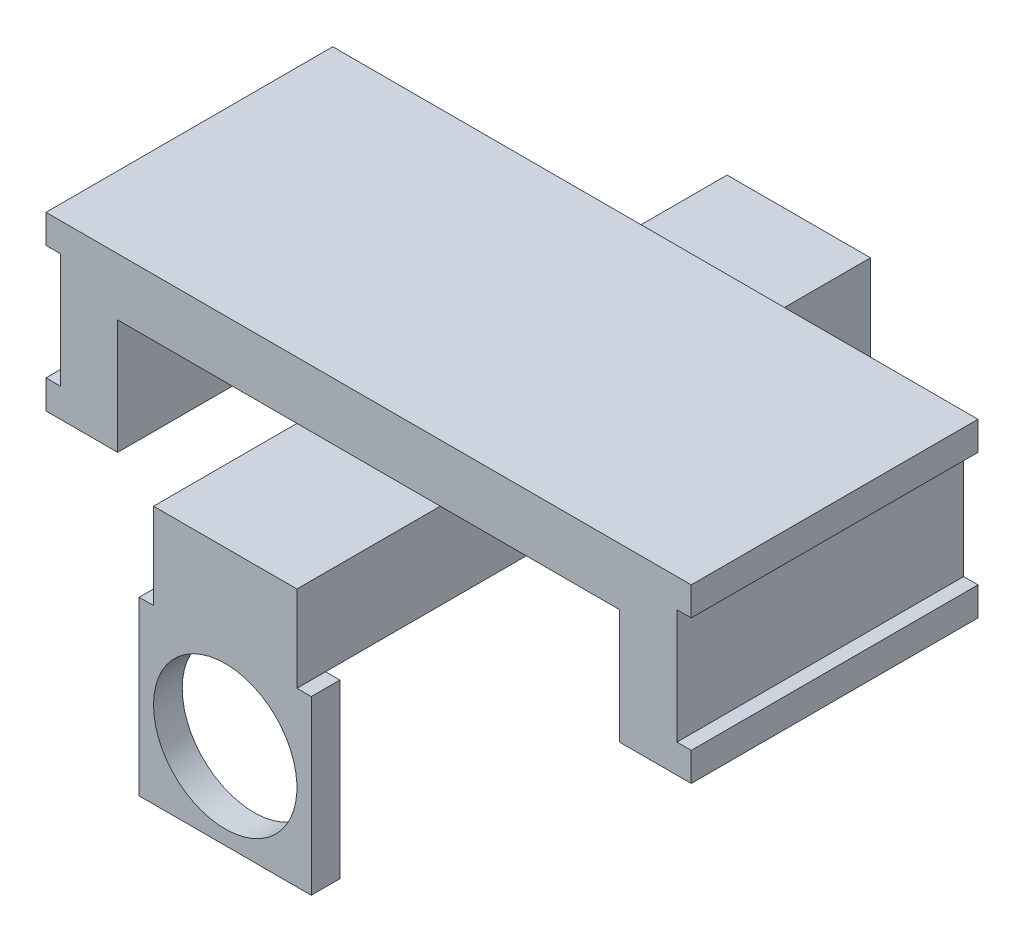
ISO-10303-21;
HEADER;
FILE_DESCRIPTION(('STEP AP214'),'2;1');
FILE_NAME('part.step','',(''),(''),'','','');
FILE_SCHEMA(('AUTOMOTIVE_DESIGN { 1 0 10303 214 1 1 1 1 }'));
ENDSEC;
DATA;
#1=APPLICATION_CONTEXT('core data for automotive mechanical design processes');
#2=APPLICATION_PROTOCOL_DEFINITION('international standard','automotive_design',2000,#1);
#3=PRODUCT_CONTEXT('',#1,'mechanical');
#4=PRODUCT('Part','Part','',(#3));
#5=PRODUCT_RELATED_PRODUCT_CATEGORY('part','',(#4));
#6=PRODUCT_DEFINITION_FORMATION('','',#4);
#7=PRODUCT_DEFINITION_CONTEXT('part definition',#1,'design');
#8=PRODUCT_DEFINITION('design','',#6,#7);
#9=PRODUCT_DEFINITION_SHAPE('','',#8);
#10=(LENGTH_UNIT() NAMED_UNIT(*) SI_UNIT(.MILLI.,.METRE.));
#11=(NAMED_UNIT(*) PLANE_ANGLE_UNIT() SI_UNIT($,.RADIAN.));
#12=(NAMED_UNIT(*) SI_UNIT($,.STERADIAN.) SOLID_ANGLE_UNIT());
#13=UNCERTAINTY_MEASURE_WITH_UNIT(LENGTH_MEASURE(1.E-05),#10,'distance_accuracy_value','');
#14=(GEOMETRIC_REPRESENTATION_CONTEXT(3) GLOBAL_UNCERTAINTY_ASSIGNED_CONTEXT((#13)) GLOBAL_UNIT_ASSIGNED_CONTEXT((#10,
#11,#12)) REPRESENTATION_CONTEXT('',''));
#15=CARTESIAN_POINT('',(0.,0.,0.));
#16=DIRECTION('',(0.,0.,1.));
#17=DIRECTION('',(1.,0.,0.));
#18=AXIS2_PLACEMENT_3D('',#15,#16,#17);
#19=CARTESIAN_POINT('',(0.,2.54,0.));
#20=DIRECTION('',(0.,-1.,0.));
#21=DIRECTION('',(0.,0.,-1.));
#22=AXIS2_PLACEMENT_3D('',#19,#20,#21);
#23=PLANE('',#22);
#24=DIRECTION('',(0.,0.,1.));
#25=VECTOR('',#24,1.);
#26=CARTESIAN_POINT('',(6.35,2.54,0.));
#27=LINE('',#26,#25);
#28=CARTESIAN_POINT('',(6.35,2.54,-22.86));
#29=VERTEX_POINT('',#28);
#30=CARTESIAN_POINT('',(6.35,2.54,22.86));
#31=VERTEX_POINT('',#30);
#32=EDGE_CURVE('E340',#29,#31,#27,.T.);
#33=ORIENTED_EDGE('',*,*,#32,.T.);
#34=DIRECTION('',(1.,0.,0.));
#35=VECTOR('',#34,1.);
#36=CARTESIAN_POINT('',(-7.62,2.54,22.86));
#37=LINE('',#36,#35);
#38=CARTESIAN_POINT('',(-6.35,2.54,22.86));
#39=VERTEX_POINT('',#38);
#40=EDGE_CURVE('E57',#39,#31,#37,.T.);
#41=ORIENTED_EDGE('',*,*,#40,.F.);
#42=DIRECTION('',(0.,0.,-1.));
#43=VECTOR('',#42,1.);
#44=CARTESIAN_POINT('',(-6.35,2.54,0.));
#45=LINE('',#44,#43);
#46=CARTESIAN_POINT('',(-6.35,2.54,-22.86));
#47=VERTEX_POINT('',#46);
#48=EDGE_CURVE('E341',#39,#47,#45,.T.);
#49=ORIENTED_EDGE('',*,*,#48,.T.);
#50=DIRECTION('',(1.,0.,0.));
#51=VECTOR('',#50,1.);
#52=CARTESIAN_POINT('',(-7.62,2.54,-22.86));
#53=LINE('',#52,#51);
#54=EDGE_CURVE('E11',#47,#29,#53,.T.);
#55=ORIENTED_EDGE('',*,*,#54,.T.);
#56=EDGE_LOOP('',(#33,#41,#49,#55));
#57=FACE_BOUND('',#56,.T.);
#58=ADVANCED_FACE('F39',(#57),#23,.T.);
#59=CARTESIAN_POINT('',(0.,10.16,0.));
#60=DIRECTION('',(0.,-1.,0.));
#61=DIRECTION('',(0.,0.,-1.));
#62=AXIS2_PLACEMENT_3D('',#59,#60,#61);
#63=PLANE('',#62);
#64=DIRECTION('',(1.,0.,0.));
#65=VECTOR('',#64,1.);
#66=CARTESIAN_POINT('',(-22.225,10.16,-12.7));
#67=LINE('',#66,#65);
#68=CARTESIAN_POINT('',(-22.225,10.16,-12.7));
#69=VERTEX_POINT('',#68);
#70=CARTESIAN_POINT('',(-6.35,10.16,-12.7));
#71=VERTEX_POINT('',#70);
#72=EDGE_CURVE('E426',#69,#71,#67,.T.);
#73=ORIENTED_EDGE('',*,*,#72,.T.);
#74=DIRECTION('',(0.,0.,1.));
#75=VECTOR('',#74,1.);
#76=CARTESIAN_POINT('',(-6.35,10.16,0.));
#77=LINE('',#76,#75);
#78=CARTESIAN_POINT('',(-6.35,10.16,12.7));
#79=VERTEX_POINT('',#78);
#80=EDGE_CURVE('E43',#71,#79,#77,.T.);
#81=ORIENTED_EDGE('',*,*,#80,.T.);
#82=DIRECTION('',(-1.,0.,0.));
#83=VECTOR('',#82,1.);
#84=CARTESIAN_POINT('',(-22.225,10.16,12.7));
#85=LINE('',#84,#83);
#86=CARTESIAN_POINT('',(-22.225,10.16,12.7));
#87=VERTEX_POINT('',#86);
#88=EDGE_CURVE('E433',#79,#87,#85,.T.);
#89=ORIENTED_EDGE('',*,*,#88,.T.);
#90=DIRECTION('',(0.,0.,-1.));
#91=VECTOR('',#90,1.);
#92=CARTESIAN_POINT('',(-22.225,10.16,12.7));
#93=LINE('',#92,#91);
#94=EDGE_CURVE('E421',#87,#69,#93,.T.);
#95=ORIENTED_EDGE('',*,*,#94,.T.);
#96=EDGE_LOOP('',(#73,#81,#89,#95));
#97=FACE_BOUND('',#96,.T.);
#98=ADVANCED_FACE('F497',(#97),#63,.T.);
#99=CARTESIAN_POINT('',(22.225,10.16,12.7));
#100=VERTEX_POINT('',#99);
#101=CARTESIAN_POINT('',(6.35,10.16,12.7));
#102=VERTEX_POINT('',#101);
#103=EDGE_CURVE('E434',#100,#102,#85,.T.);
#104=ORIENTED_EDGE('',*,*,#103,.T.);
#105=DIRECTION('',(0.,0.,-1.));
#106=VECTOR('',#105,1.);
#107=CARTESIAN_POINT('',(6.35,10.16,0.));
#108=LINE('',#107,#106);
#109=CARTESIAN_POINT('',(6.35,10.16,-12.7));
#110=VERTEX_POINT('',#109);
#111=EDGE_CURVE('E488',#102,#110,#108,.T.);
#112=ORIENTED_EDGE('',*,*,#111,.T.);
#113=CARTESIAN_POINT('',(22.225,10.16,-12.7));
#114=VERTEX_POINT('',#113);
#115=EDGE_CURVE('E424',#110,#114,#67,.T.);
#116=ORIENTED_EDGE('',*,*,#115,.T.);
#117=DIRECTION('',(0.,0.,1.));
#118=VECTOR('',#117,1.);
#119=CARTESIAN_POINT('',(22.225,10.16,12.7));
#120=LINE('',#119,#118);
#121=EDGE_CURVE('E429',#114,#100,#120,.T.);
#122=ORIENTED_EDGE('',*,*,#121,.T.);
#123=EDGE_LOOP('',(#104,#112,#116,#122));
#124=FACE_BOUND('',#123,.T.);
#125=ADVANCED_FACE('F547',(#124),#63,.T.);
#126=CARTESIAN_POINT('',(28.575,15.24,12.7));
#127=DIRECTION('',(-1.,0.,0.));
#128=DIRECTION('',(0.,0.,1.));
#129=AXIS2_PLACEMENT_3D('',#126,#127,#128);
#130=PLANE('',#129);
#131=DIRECTION('',(0.,-1.,0.));
#132=VECTOR('',#131,1.);
#133=CARTESIAN_POINT('',(28.575,15.24,-12.7));
#134=LINE('',#133,#132);
#135=CARTESIAN_POINT('',(28.575,2.54000000000001,-12.7));
#136=VERTEX_POINT('',#135);
#137=CARTESIAN_POINT('',(28.575,0.,-12.7));
#138=VERTEX_POINT('',#137);
#139=EDGE_CURVE('E485',#136,#138,#134,.T.);
#140=ORIENTED_EDGE('',*,*,#139,.F.);
#141=DIRECTION('',(0.,0.,1.));
#142=VECTOR('',#141,1.);
#143=CARTESIAN_POINT('',(28.575,2.54000000000001,-12.7));
#144=LINE('',#143,#142);
#145=CARTESIAN_POINT('',(28.575,2.54000000000001,12.7));
#146=VERTEX_POINT('',#145);
#147=EDGE_CURVE('E368',#136,#146,#144,.T.);
#148=ORIENTED_EDGE('',*,*,#147,.T.);
#149=DIRECTION('',(0.,-1.,0.));
#150=VECTOR('',#149,1.);
#151=CARTESIAN_POINT('',(28.575,15.24,12.7));
#152=LINE('',#151,#150);
#153=CARTESIAN_POINT('',(28.575,0.,12.7));
#154=VERTEX_POINT('',#153);
#155=EDGE_CURVE('E461',#146,#154,#152,.T.);
#156=ORIENTED_EDGE('',*,*,#155,.T.);
#157=DIRECTION('',(0.,0.,-1.));
#158=VECTOR('',#157,1.);
#159=CARTESIAN_POINT('',(28.575,0.,12.7));
#160=LINE('',#159,#158);
#161=EDGE_CURVE('E443',#154,#138,#160,.T.);
#162=ORIENTED_EDGE('',*,*,#161,.T.);
#163=EDGE_LOOP('',(#140,#148,#156,#162));
#164=FACE_BOUND('',#163,.T.);
#165=ADVANCED_FACE('F623',(#164),#130,.F.);
#166=CARTESIAN_POINT('',(-28.575,15.24,12.7));
#167=DIRECTION('',(1.,0.,0.));
#168=DIRECTION('',(0.,0.,-1.));
#169=AXIS2_PLACEMENT_3D('',#166,#167,#168);
#170=PLANE('',#169);
#171=DIRECTION('',(0.,-1.,0.));
#172=VECTOR('',#171,1.);
#173=CARTESIAN_POINT('',(-28.575,15.24,-12.7));
#174=LINE('',#173,#172);
#175=CARTESIAN_POINT('',(-28.575,15.24,-12.7));
#176=VERTEX_POINT('',#175);
#177=CARTESIAN_POINT('',(-28.575,12.7,-12.7));
#178=VERTEX_POINT('',#177);
#179=EDGE_CURVE('E482',#176,#178,#174,.T.);
#180=ORIENTED_EDGE('',*,*,#179,.T.);
#181=DIRECTION('',(0.,0.,1.));
#182=VECTOR('',#181,1.);
#183=CARTESIAN_POINT('',(-28.575,12.7,-12.7));
#184=LINE('',#183,#182);
#185=CARTESIAN_POINT('',(-28.575,12.7,12.7));
#186=VERTEX_POINT('',#185);
#187=EDGE_CURVE('E388',#178,#186,#184,.T.);
#188=ORIENTED_EDGE('',*,*,#187,.T.);
#189=DIRECTION('',(0.,-1.,0.));
#190=VECTOR('',#189,1.);
#191=CARTESIAN_POINT('',(-28.575,15.24,12.7));
#192=LINE('',#191,#190);
#193=CARTESIAN_POINT('',(-28.575,15.24,12.7));
#194=VERTEX_POINT('',#193);
#195=EDGE_CURVE('E478',#194,#186,#192,.T.);
#196=ORIENTED_EDGE('',*,*,#195,.F.);
#197=DIRECTION('',(0.,0.,1.));
#198=VECTOR('',#197,1.);
#199=CARTESIAN_POINT('',(-28.575,15.24,12.7));
#200=LINE('',#199,#198);
#201=EDGE_CURVE('E457',#176,#194,#200,.T.);
#202=ORIENTED_EDGE('',*,*,#201,.F.);
#203=EDGE_LOOP('',(#180,#188,#196,#202));
#204=FACE_BOUND('',#203,.T.);
#205=ADVANCED_FACE('F615',(#204),#170,.F.);
#206=CARTESIAN_POINT('',(0.,0.,0.));
#207=DIRECTION('',(0.,-1.,0.));
#208=DIRECTION('',(0.,0.,-1.));
#209=AXIS2_PLACEMENT_3D('',#206,#207,#208);
#210=PLANE('',#209);
#211=DIRECTION('',(0.,0.,-1.));
#212=VECTOR('',#211,1.);
#213=CARTESIAN_POINT('',(-22.225,0.,12.7));
#214=LINE('',#213,#212);
#215=CARTESIAN_POINT('',(-22.225,0.,12.7));
#216=VERTEX_POINT('',#215);
#217=CARTESIAN_POINT('',(-22.225,0.,-12.7));
#218=VERTEX_POINT('',#217);
#219=EDGE_CURVE('E391',#216,#218,#214,.T.);
#220=ORIENTED_EDGE('',*,*,#219,.F.);
#221=DIRECTION('',(1.,0.,0.));
#222=VECTOR('',#221,1.);
#223=CARTESIAN_POINT('',(-28.575,0.,12.7));
#224=LINE('',#223,#222);
#225=CARTESIAN_POINT('',(-28.575,0.,12.7));
#226=VERTEX_POINT('',#225);
#227=EDGE_CURVE('E455',#226,#216,#224,.T.);
#228=ORIENTED_EDGE('',*,*,#227,.F.);
#229=DIRECTION('',(0.,0.,1.));
#230=VECTOR('',#229,1.);
#231=CARTESIAN_POINT('',(-28.575,0.,12.7));
#232=LINE('',#231,#230);
#233=CARTESIAN_POINT('',(-28.575,0.,-12.7));
#234=VERTEX_POINT('',#233);
#235=EDGE_CURVE('E468',#234,#226,#232,.T.);
#236=ORIENTED_EDGE('',*,*,#235,.F.);
#237=DIRECTION('',(-1.,0.,0.));
#238=VECTOR('',#237,1.);
#239=CARTESIAN_POINT('',(-28.575,0.,-12.7));
#240=LINE('',#239,#238);
#241=EDGE_CURVE('E464',#218,#234,#240,.T.);
#242=ORIENTED_EDGE('',*,*,#241,.F.);
#243=EDGE_LOOP('',(#220,#228,#236,#242));
#244=FACE_BOUND('',#243,.T.);
#245=ADVANCED_FACE('F608',(#244),#210,.T.);
#246=CARTESIAN_POINT('',(28.575,15.24,12.7));
#247=VERTEX_POINT('',#246);
#248=CARTESIAN_POINT('',(28.575,12.7,12.7));
#249=VERTEX_POINT('',#248);
#250=EDGE_CURVE('E474',#247,#249,#152,.T.);
#251=ORIENTED_EDGE('',*,*,#250,.T.);
#252=DIRECTION('',(0.,0.,1.));
#253=VECTOR('',#252,1.);
#254=CARTESIAN_POINT('',(28.575,12.7,-12.7));
#255=LINE('',#254,#253);
#256=CARTESIAN_POINT('',(28.575,12.7,-12.7));
#257=VERTEX_POINT('',#256);
#258=EDGE_CURVE('E397',#257,#249,#255,.T.);
#259=ORIENTED_EDGE('',*,*,#258,.F.);
#260=CARTESIAN_POINT('',(28.575,15.24,-12.7));
#261=VERTEX_POINT('',#260);
#262=EDGE_CURVE('E486',#261,#257,#134,.T.);
#263=ORIENTED_EDGE('',*,*,#262,.F.);
#264=DIRECTION('',(0.,0.,-1.));
#265=VECTOR('',#264,1.);
#266=CARTESIAN_POINT('',(28.575,15.24,12.7));
#267=LINE('',#266,#265);
#268=EDGE_CURVE('E451',#247,#261,#267,.T.);
#269=ORIENTED_EDGE('',*,*,#268,.F.);
#270=EDGE_LOOP('',(#251,#259,#263,#269));
#271=FACE_BOUND('',#270,.T.);
#272=ADVANCED_FACE('F41',(#271),#130,.F.);
#273=CARTESIAN_POINT('',(-28.575,15.24,-12.7));
#274=DIRECTION('',(0.,0.,1.));
#275=DIRECTION('',(1.,0.,0.));
#276=AXIS2_PLACEMENT_3D('',#273,#274,#275);
#277=PLANE('',#276);
#278=DIRECTION('',(0.,1.,0.));
#279=VECTOR('',#278,1.);
#280=CARTESIAN_POINT('',(-27.305,12.7,-12.7));
#281=LINE('',#280,#279);
#282=CARTESIAN_POINT('',(-27.305,2.54,-12.7));
#283=VERTEX_POINT('',#282);
#284=CARTESIAN_POINT('',(-27.305,12.7,-12.7));
#285=VERTEX_POINT('',#284);
#286=EDGE_CURVE('E372',#283,#285,#281,.T.);
#287=ORIENTED_EDGE('',*,*,#286,.T.);
#288=DIRECTION('',(-1.,0.,0.));
#289=VECTOR('',#288,1.);
#290=CARTESIAN_POINT('',(-28.575,12.7,-12.7));
#291=LINE('',#290,#289);
#292=EDGE_CURVE('E376',#285,#178,#291,.T.);
#293=ORIENTED_EDGE('',*,*,#292,.T.);
#294=ORIENTED_EDGE('',*,*,#179,.F.);
#295=DIRECTION('',(-1.,0.,0.));
#296=VECTOR('',#295,1.);
#297=CARTESIAN_POINT('',(-28.575,15.24,-12.7));
#298=LINE('',#297,#296);
#299=EDGE_CURVE('E454',#261,#176,#298,.T.);
#300=ORIENTED_EDGE('',*,*,#299,.F.);
#301=ORIENTED_EDGE('',*,*,#262,.T.);
#302=DIRECTION('',(-1.,0.,0.));
#303=VECTOR('',#302,1.);
#304=CARTESIAN_POINT('',(28.575,12.7,-12.7));
#305=LINE('',#304,#303);
#306=CARTESIAN_POINT('',(27.305,12.7,-12.7));
#307=VERTEX_POINT('',#306);
#308=EDGE_CURVE('E409',#257,#307,#305,.T.);
#309=ORIENTED_EDGE('',*,*,#308,.T.);
#310=DIRECTION('',(0.,-1.,0.));
#311=VECTOR('',#310,1.);
#312=CARTESIAN_POINT('',(27.305,12.7,-12.7));
#313=LINE('',#312,#311);
#314=CARTESIAN_POINT('',(27.305,2.54000000000001,-12.7));
#315=VERTEX_POINT('',#314);
#316=EDGE_CURVE('E416',#307,#315,#313,.T.);
#317=ORIENTED_EDGE('',*,*,#316,.T.);
#318=DIRECTION('',(1.,0.,0.));
#319=VECTOR('',#318,1.);
#320=CARTESIAN_POINT('',(28.575,2.54000000000001,-12.7));
#321=LINE('',#320,#319);
#322=EDGE_CURVE('E399',#315,#136,#321,.T.);
#323=ORIENTED_EDGE('',*,*,#322,.T.);
#324=ORIENTED_EDGE('',*,*,#139,.T.);
#325=CARTESIAN_POINT('',(22.225,0.,-12.7));
#326=VERTEX_POINT('',#325);
#327=EDGE_CURVE('E465',#138,#326,#240,.T.);
#328=ORIENTED_EDGE('',*,*,#327,.T.);
#329=DIRECTION('',(0.,-1.,0.));
#330=VECTOR('',#329,1.);
#331=CARTESIAN_POINT('',(22.225,10.16,-12.7));
#332=LINE('',#331,#330);
#333=EDGE_CURVE('E447',#114,#326,#332,.T.);
#334=ORIENTED_EDGE('',*,*,#333,.F.);
#335=ORIENTED_EDGE('',*,*,#115,.F.);
#336=EDGE_CURVE('E430',#71,#110,#67,.T.);
#337=ORIENTED_EDGE('',*,*,#336,.F.);
#338=ORIENTED_EDGE('',*,*,#72,.F.);
#339=DIRECTION('',(0.,-1.,0.));
#340=VECTOR('',#339,1.);
#341=CARTESIAN_POINT('',(-22.225,10.16,-12.7));
#342=LINE('',#341,#340);
#343=EDGE_CURVE('E437',#69,#218,#342,.T.);
#344=ORIENTED_EDGE('',*,*,#343,.T.);
#345=ORIENTED_EDGE('',*,*,#241,.T.);
#346=CARTESIAN_POINT('',(-28.575,2.54,-12.7));
#347=VERTEX_POINT('',#346);
#348=EDGE_CURVE('E481',#347,#234,#174,.T.);
#349=ORIENTED_EDGE('',*,*,#348,.F.);
#350=DIRECTION('',(1.,0.,0.));
#351=VECTOR('',#350,1.);
#352=CARTESIAN_POINT('',(-28.575,2.54,-12.7));
#353=LINE('',#352,#351);
#354=EDGE_CURVE('E369',#347,#283,#353,.T.);
#355=ORIENTED_EDGE('',*,*,#354,.T.);
#356=EDGE_LOOP('',(#287,#293,#294,#300,#301,#309,#317,#323,#324,#328,#334,#335,#337,#338,#344,
#345,#349,#355));
#357=FACE_BOUND('',#356,.T.);
#358=ADVANCED_FACE('F613',(#357),#277,.F.);
#359=CARTESIAN_POINT('',(-28.575,2.54000000000001,12.7));
#360=VERTEX_POINT('',#359);
#361=EDGE_CURVE('E477',#360,#226,#192,.T.);
#362=ORIENTED_EDGE('',*,*,#361,.F.);
#363=DIRECTION('',(0.,0.,1.));
#364=VECTOR('',#363,1.);
#365=CARTESIAN_POINT('',(-28.575,2.54,-12.7));
#366=LINE('',#365,#364);
#367=EDGE_CURVE('E379',#347,#360,#366,.T.);
#368=ORIENTED_EDGE('',*,*,#367,.F.);
#369=ORIENTED_EDGE('',*,*,#348,.T.);
#370=ORIENTED_EDGE('',*,*,#235,.T.);
#371=EDGE_LOOP('',(#362,#368,#369,#370));
#372=FACE_BOUND('',#371,.T.);
#373=ADVANCED_FACE('F611',(#372),#170,.F.);
#374=CARTESIAN_POINT('',(-28.575,15.24,12.7));
#375=DIRECTION('',(0.,0.,-1.));
#376=DIRECTION('',(-1.,0.,0.));
#377=AXIS2_PLACEMENT_3D('',#374,#375,#376);
#378=PLANE('',#377);
#379=ORIENTED_EDGE('',*,*,#195,.T.);
#380=DIRECTION('',(-1.,0.,0.));
#381=VECTOR('',#380,1.);
#382=CARTESIAN_POINT('',(-28.575,12.7,12.7));
#383=LINE('',#382,#381);
#384=CARTESIAN_POINT('',(-27.305,12.7,12.7));
#385=VERTEX_POINT('',#384);
#386=EDGE_CURVE('E373',#385,#186,#383,.T.);
#387=ORIENTED_EDGE('',*,*,#386,.F.);
#388=DIRECTION('',(0.,1.,0.));
#389=VECTOR('',#388,1.);
#390=CARTESIAN_POINT('',(-27.305,12.7,12.7));
#391=LINE('',#390,#389);
#392=CARTESIAN_POINT('',(-27.305,2.54,12.7));
#393=VERTEX_POINT('',#392);
#394=EDGE_CURVE('E383',#393,#385,#391,.T.);
#395=ORIENTED_EDGE('',*,*,#394,.F.);
#396=DIRECTION('',(1.,0.,0.));
#397=VECTOR('',#396,1.);
#398=CARTESIAN_POINT('',(-28.575,2.54,12.7));
#399=LINE('',#398,#397);
#400=EDGE_CURVE('E380',#360,#393,#399,.T.);
#401=ORIENTED_EDGE('',*,*,#400,.F.);
#402=ORIENTED_EDGE('',*,*,#361,.T.);
#403=ORIENTED_EDGE('',*,*,#227,.T.);
#404=DIRECTION('',(0.,-1.,0.));
#405=VECTOR('',#404,1.);
#406=CARTESIAN_POINT('',(-22.225,10.16,12.7));
#407=LINE('',#406,#405);
#408=EDGE_CURVE('E441',#87,#216,#407,.T.);
#409=ORIENTED_EDGE('',*,*,#408,.F.);
#410=ORIENTED_EDGE('',*,*,#88,.F.);
#411=EDGE_CURVE('E438',#102,#79,#85,.T.);
#412=ORIENTED_EDGE('',*,*,#411,.F.);
#413=ORIENTED_EDGE('',*,*,#103,.F.);
#414=DIRECTION('',(0.,-1.,0.));
#415=VECTOR('',#414,1.);
#416=CARTESIAN_POINT('',(22.225,10.16,12.7));
#417=LINE('',#416,#415);
#418=CARTESIAN_POINT('',(22.225,0.,12.7));
#419=VERTEX_POINT('',#418);
#420=EDGE_CURVE('E444',#100,#419,#417,.T.);
#421=ORIENTED_EDGE('',*,*,#420,.T.);
#422=EDGE_CURVE('E471',#419,#154,#224,.T.);
#423=ORIENTED_EDGE('',*,*,#422,.T.);
#424=ORIENTED_EDGE('',*,*,#155,.F.);
#425=DIRECTION('',(1.,0.,0.));
#426=VECTOR('',#425,1.);
#427=CARTESIAN_POINT('',(28.575,2.54000000000001,12.7));
#428=LINE('',#427,#426);
#429=CARTESIAN_POINT('',(27.305,2.54000000000001,12.7));
#430=VERTEX_POINT('',#429);
#431=EDGE_CURVE('E406',#430,#146,#428,.T.);
#432=ORIENTED_EDGE('',*,*,#431,.F.);
#433=DIRECTION('',(0.,-1.,0.));
#434=VECTOR('',#433,1.);
#435=CARTESIAN_POINT('',(27.305,12.7,12.7));
#436=LINE('',#435,#434);
#437=CARTESIAN_POINT('',(27.305,12.7,12.7));
#438=VERTEX_POINT('',#437);
#439=EDGE_CURVE('E408',#438,#430,#436,.T.);
#440=ORIENTED_EDGE('',*,*,#439,.F.);
#441=DIRECTION('',(-1.,0.,0.));
#442=VECTOR('',#441,1.);
#443=CARTESIAN_POINT('',(28.575,12.7,12.7));
#444=LINE('',#443,#442);
#445=EDGE_CURVE('E384',#249,#438,#444,.T.);
#446=ORIENTED_EDGE('',*,*,#445,.F.);
#447=ORIENTED_EDGE('',*,*,#250,.F.);
#448=DIRECTION('',(1.,0.,0.));
#449=VECTOR('',#448,1.);
#450=CARTESIAN_POINT('',(-28.575,15.24,12.7));
#451=LINE('',#450,#449);
#452=EDGE_CURVE('E459',#194,#247,#451,.T.);
#453=ORIENTED_EDGE('',*,*,#452,.F.);
#454=EDGE_LOOP('',(#379,#387,#395,#401,#402,#403,#409,#410,#412,#413,#421,#423,#424,#432,#440,
#446,#447,#453));
#455=FACE_BOUND('',#454,.T.);
#456=ADVANCED_FACE('F505',(#455),#378,.F.);
#457=CARTESIAN_POINT('',(0.,15.24,0.));
#458=DIRECTION('',(0.,-1.,0.));
#459=DIRECTION('',(0.,0.,-1.));
#460=AXIS2_PLACEMENT_3D('',#457,#458,#459);
#461=PLANE('',#460);
#462=ORIENTED_EDGE('',*,*,#268,.T.);
#463=ORIENTED_EDGE('',*,*,#299,.T.);
#464=ORIENTED_EDGE('',*,*,#201,.T.);
#465=ORIENTED_EDGE('',*,*,#452,.T.);
#466=EDGE_LOOP('',(#462,#463,#464,#465));
#467=FACE_BOUND('',#466,.T.);
#468=ADVANCED_FACE('F601',(#467),#461,.F.);
#469=DIRECTION('',(0.,0.,1.));
#470=VECTOR('',#469,1.);
#471=CARTESIAN_POINT('',(22.225,0.,12.7));
#472=LINE('',#471,#470);
#473=EDGE_CURVE('E425',#326,#419,#472,.T.);
#474=ORIENTED_EDGE('',*,*,#473,.F.);
#475=ORIENTED_EDGE('',*,*,#327,.F.);
#476=ORIENTED_EDGE('',*,*,#161,.F.);
#477=ORIENTED_EDGE('',*,*,#422,.F.);
#478=EDGE_LOOP('',(#474,#475,#476,#477));
#479=FACE_BOUND('',#478,.T.);
#480=ADVANCED_FACE('F599',(#479),#210,.T.);
#481=CARTESIAN_POINT('',(-22.225,10.16,12.7));
#482=DIRECTION('',(-1.,0.,0.));
#483=DIRECTION('',(0.,0.,1.));
#484=AXIS2_PLACEMENT_3D('',#481,#482,#483);
#485=PLANE('',#484);
#486=ORIENTED_EDGE('',*,*,#219,.T.);
#487=ORIENTED_EDGE('',*,*,#343,.F.);
#488=ORIENTED_EDGE('',*,*,#94,.F.);
#489=ORIENTED_EDGE('',*,*,#408,.T.);
#490=EDGE_LOOP('',(#486,#487,#488,#489));
#491=FACE_BOUND('',#490,.T.);
#492=ADVANCED_FACE('F595',(#491),#485,.F.);
#493=CARTESIAN_POINT('',(22.225,10.16,12.7));
#494=DIRECTION('',(1.,0.,0.));
#495=DIRECTION('',(0.,0.,-1.));
#496=AXIS2_PLACEMENT_3D('',#493,#494,#495);
#497=PLANE('',#496);
#498=ORIENTED_EDGE('',*,*,#473,.T.);
#499=ORIENTED_EDGE('',*,*,#420,.F.);
#500=ORIENTED_EDGE('',*,*,#121,.F.);
#501=ORIENTED_EDGE('',*,*,#333,.T.);
#502=EDGE_LOOP('',(#498,#499,#500,#501));
#503=FACE_BOUND('',#502,.T.);
#504=ADVANCED_FACE('F590',(#503),#497,.F.);
#505=CARTESIAN_POINT('',(28.575,2.54000000000001,-12.7));
#506=DIRECTION('',(0.,-1.,0.));
#507=DIRECTION('',(0.,0.,-1.));
#508=AXIS2_PLACEMENT_3D('',#505,#506,#507);
#509=PLANE('',#508);
#510=ORIENTED_EDGE('',*,*,#431,.T.);
#511=ORIENTED_EDGE('',*,*,#147,.F.);
#512=ORIENTED_EDGE('',*,*,#322,.F.);
#513=DIRECTION('',(0.,0.,1.));
#514=VECTOR('',#513,1.);
#515=CARTESIAN_POINT('',(27.305,2.54000000000001,-12.7));
#516=LINE('',#515,#514);
#517=EDGE_CURVE('E402',#315,#430,#516,.T.);
#518=ORIENTED_EDGE('',*,*,#517,.T.);
#519=EDGE_LOOP('',(#510,#511,#512,#518));
#520=FACE_BOUND('',#519,.T.);
#521=ADVANCED_FACE('F587',(#520),#509,.F.);
#522=CARTESIAN_POINT('',(27.305,12.7,-12.7));
#523=DIRECTION('',(-1.,0.,0.));
#524=DIRECTION('',(0.,-1.,0.));
#525=AXIS2_PLACEMENT_3D('',#522,#523,#524);
#526=PLANE('',#525);
#527=ORIENTED_EDGE('',*,*,#439,.T.);
#528=ORIENTED_EDGE('',*,*,#517,.F.);
#529=ORIENTED_EDGE('',*,*,#316,.F.);
#530=DIRECTION('',(0.,0.,1.));
#531=VECTOR('',#530,1.);
#532=CARTESIAN_POINT('',(27.305,12.7,-12.7));
#533=LINE('',#532,#531);
#534=EDGE_CURVE('E400',#307,#438,#533,.T.);
#535=ORIENTED_EDGE('',*,*,#534,.T.);
#536=EDGE_LOOP('',(#527,#528,#529,#535));
#537=FACE_BOUND('',#536,.T.);
#538=ADVANCED_FACE('F583',(#537),#526,.F.);
#539=CARTESIAN_POINT('',(28.575,12.7,-12.7));
#540=DIRECTION('',(0.,1.,0.));
#541=DIRECTION('',(0.,0.,1.));
#542=AXIS2_PLACEMENT_3D('',#539,#540,#541);
#543=PLANE('',#542);
#544=ORIENTED_EDGE('',*,*,#445,.T.);
#545=ORIENTED_EDGE('',*,*,#534,.F.);
#546=ORIENTED_EDGE('',*,*,#308,.F.);
#547=ORIENTED_EDGE('',*,*,#258,.T.);
#548=EDGE_LOOP('',(#544,#545,#546,#547));
#549=FACE_BOUND('',#548,.T.);
#550=ADVANCED_FACE('F573',(#549),#543,.F.);
#551=CARTESIAN_POINT('',(-28.575,12.7,-12.7));
#552=DIRECTION('',(0.,1.,0.));
#553=DIRECTION('',(-1.,0.,0.));
#554=AXIS2_PLACEMENT_3D('',#551,#552,#553);
#555=PLANE('',#554);
#556=ORIENTED_EDGE('',*,*,#386,.T.);
#557=ORIENTED_EDGE('',*,*,#187,.F.);
#558=ORIENTED_EDGE('',*,*,#292,.F.);
#559=DIRECTION('',(0.,0.,1.));
#560=VECTOR('',#559,1.);
#561=CARTESIAN_POINT('',(-27.305,12.7,-12.7));
#562=LINE('',#561,#560);
#563=EDGE_CURVE('E392',#285,#385,#562,.T.);
#564=ORIENTED_EDGE('',*,*,#563,.T.);
#565=EDGE_LOOP('',(#556,#557,#558,#564));
#566=FACE_BOUND('',#565,.T.);
#567=ADVANCED_FACE('F569',(#566),#555,.F.);
#568=CARTESIAN_POINT('',(-27.305,12.7,-12.7));
#569=DIRECTION('',(1.,0.,0.));
#570=DIRECTION('',(0.,0.,-1.));
#571=AXIS2_PLACEMENT_3D('',#568,#569,#570);
#572=PLANE('',#571);
#573=ORIENTED_EDGE('',*,*,#394,.T.);
#574=ORIENTED_EDGE('',*,*,#563,.F.);
#575=ORIENTED_EDGE('',*,*,#286,.F.);
#576=DIRECTION('',(0.,0.,1.));
#577=VECTOR('',#576,1.);
#578=CARTESIAN_POINT('',(-27.305,2.54,-12.7));
#579=LINE('',#578,#577);
#580=EDGE_CURVE('E394',#283,#393,#579,.T.);
#581=ORIENTED_EDGE('',*,*,#580,.T.);
#582=EDGE_LOOP('',(#573,#574,#575,#581));
#583=FACE_BOUND('',#582,.T.);
#584=ADVANCED_FACE('F572',(#583),#572,.F.);
#585=CARTESIAN_POINT('',(-28.575,2.54,-12.7));
#586=DIRECTION('',(0.,-1.,0.));
#587=DIRECTION('',(1.,0.,0.));
#588=AXIS2_PLACEMENT_3D('',#585,#586,#587);
#589=PLANE('',#588);
#590=ORIENTED_EDGE('',*,*,#400,.T.);
#591=ORIENTED_EDGE('',*,*,#580,.F.);
#592=ORIENTED_EDGE('',*,*,#354,.F.);
#593=ORIENTED_EDGE('',*,*,#367,.T.);
#594=EDGE_LOOP('',(#590,#591,#592,#593));
#595=FACE_BOUND('',#594,.T.);
#596=ADVANCED_FACE('F556',(#595),#589,.F.);
#597=CARTESIAN_POINT('',(0.,10.16,0.));
#598=DIRECTION('',(0.,-1.,0.));
#599=DIRECTION('',(0.,0.,-1.));
#600=AXIS2_PLACEMENT_3D('',#597,#598,#599);
#601=PLANE('',#600);
#602=DIRECTION('',(0.,0.,-1.));
#603=VECTOR('',#602,1.);
#604=CARTESIAN_POINT('',(-6.35,10.16,0.));
#605=LINE('',#604,#603);
#606=CARTESIAN_POINT('',(-6.35,10.16,-25.4));
#607=VERTEX_POINT('',#606);
#608=EDGE_CURVE('E332',#71,#607,#605,.T.);
#609=ORIENTED_EDGE('',*,*,#608,.F.);
#610=ORIENTED_EDGE('',*,*,#336,.T.);
#611=DIRECTION('',(0.,0.,1.));
#612=VECTOR('',#611,1.);
#613=CARTESIAN_POINT('',(6.35,10.16,0.));
#614=LINE('',#613,#612);
#615=CARTESIAN_POINT('',(6.35,10.16,-25.4));
#616=VERTEX_POINT('',#615);
#617=EDGE_CURVE('E353',#616,#110,#614,.T.);
#618=ORIENTED_EDGE('',*,*,#617,.F.);
#619=DIRECTION('',(1.,0.,0.));
#620=VECTOR('',#619,1.);
#621=CARTESIAN_POINT('',(0.,10.16,-25.4));
#622=LINE('',#621,#620);
#623=EDGE_CURVE('E350',#607,#616,#622,.T.);
#624=ORIENTED_EDGE('',*,*,#623,.F.);
#625=EDGE_LOOP('',(#609,#610,#618,#624));
#626=FACE_BOUND('',#625,.T.);
#627=ADVANCED_FACE('F553',(#626),#601,.F.);
#628=CARTESIAN_POINT('',(6.35,10.16,25.4));
#629=VERTEX_POINT('',#628);
#630=EDGE_CURVE('E352',#102,#629,#614,.T.);
#631=ORIENTED_EDGE('',*,*,#630,.F.);
#632=ORIENTED_EDGE('',*,*,#411,.T.);
#633=CARTESIAN_POINT('',(-6.35,10.16,25.4));
#634=VERTEX_POINT('',#633);
#635=EDGE_CURVE('E347',#634,#79,#605,.T.);
#636=ORIENTED_EDGE('',*,*,#635,.F.);
#637=DIRECTION('',(-1.,0.,0.));
#638=VECTOR('',#637,1.);
#639=CARTESIAN_POINT('',(0.,10.16,25.4));
#640=LINE('',#639,#638);
#641=EDGE_CURVE('E355',#629,#634,#640,.T.);
#642=ORIENTED_EDGE('',*,*,#641,.F.);
#643=EDGE_LOOP('',(#631,#632,#636,#642));
#644=FACE_BOUND('',#643,.T.);
#645=ADVANCED_FACE('F509',(#644),#601,.F.);
#646=CARTESIAN_POINT('',(-6.35,2.54,0.));
#647=DIRECTION('',(1.,0.,0.));
#648=DIRECTION('',(0.,0.,-1.));
#649=AXIS2_PLACEMENT_3D('',#646,#647,#648);
#650=PLANE('',#649);
#651=ORIENTED_EDGE('',*,*,#635,.T.);
#652=ORIENTED_EDGE('',*,*,#80,.F.);
#653=ORIENTED_EDGE('',*,*,#608,.T.);
#654=DIRECTION('',(0.,1.,0.));
#655=VECTOR('',#654,1.);
#656=CARTESIAN_POINT('',(-6.35,2.54,-25.4));
#657=LINE('',#656,#655);
#658=CARTESIAN_POINT('',(-6.35,2.54,-25.4));
#659=VERTEX_POINT('',#658);
#660=EDGE_CURVE('E365',#659,#607,#657,.T.);
#661=ORIENTED_EDGE('',*,*,#660,.F.);
#662=EDGE_CURVE('E342',#47,#659,#45,.T.);
#663=ORIENTED_EDGE('',*,*,#662,.F.);
#664=ORIENTED_EDGE('',*,*,#48,.F.);
#665=CARTESIAN_POINT('',(-6.35,2.54,25.4));
#666=VERTEX_POINT('',#665);
#667=EDGE_CURVE('E277',#666,#39,#45,.T.);
#668=ORIENTED_EDGE('',*,*,#667,.F.);
#669=DIRECTION('',(0.,1.,0.));
#670=VECTOR('',#669,1.);
#671=CARTESIAN_POINT('',(-6.35,2.54,25.4));
#672=LINE('',#671,#670);
#673=EDGE_CURVE('E346',#666,#634,#672,.T.);
#674=ORIENTED_EDGE('',*,*,#673,.T.);
#675=EDGE_LOOP('',(#651,#652,#653,#661,#663,#664,#668,#674));
#676=FACE_BOUND('',#675,.T.);
#677=ADVANCED_FACE('F511',(#676),#650,.F.);
#678=CARTESIAN_POINT('',(0.,2.54,-25.4));
#679=DIRECTION('',(0.,0.,1.));
#680=DIRECTION('',(1.,0.,0.));
#681=AXIS2_PLACEMENT_3D('',#678,#679,#680);
#682=PLANE('',#681);
#683=ORIENTED_EDGE('',*,*,#623,.T.);
#684=DIRECTION('',(0.,1.,0.));
#685=VECTOR('',#684,1.);
#686=CARTESIAN_POINT('',(6.35,2.54,-25.4));
#687=LINE('',#686,#685);
#688=CARTESIAN_POINT('',(6.35,2.54,-25.4));
#689=VERTEX_POINT('',#688);
#690=EDGE_CURVE('E362',#689,#616,#687,.T.);
#691=ORIENTED_EDGE('',*,*,#690,.F.);
#692=DIRECTION('',(1.,0.,0.));
#693=VECTOR('',#692,1.);
#694=CARTESIAN_POINT('',(-7.62,2.54,-25.4));
#695=LINE('',#694,#693);
#696=CARTESIAN_POINT('',(7.62,2.54,-25.4));
#697=VERTEX_POINT('',#696);
#698=EDGE_CURVE('E304',#689,#697,#695,.T.);
#699=ORIENTED_EDGE('',*,*,#698,.T.);
#700=DIRECTION('',(0.,-1.,0.));
#701=VECTOR('',#700,1.);
#702=CARTESIAN_POINT('',(7.62,2.54,-25.4));
#703=LINE('',#702,#701);
#704=CARTESIAN_POINT('',(7.62,-12.7,-25.4));
#705=VERTEX_POINT('',#704);
#706=EDGE_CURVE('E321',#697,#705,#703,.T.);
#707=ORIENTED_EDGE('',*,*,#706,.T.);
#708=DIRECTION('',(-1.,0.,0.));
#709=VECTOR('',#708,1.);
#710=CARTESIAN_POINT('',(7.62,-12.7,-25.4));
#711=LINE('',#710,#709);
#712=CARTESIAN_POINT('',(-7.62,-12.7,-25.4));
#713=VERTEX_POINT('',#712);
#714=EDGE_CURVE('E324',#705,#713,#711,.T.);
#715=ORIENTED_EDGE('',*,*,#714,.T.);
#716=DIRECTION('',(0.,1.,0.));
#717=VECTOR('',#716,1.);
#718=CARTESIAN_POINT('',(-7.62,-12.7,-25.4));
#719=LINE('',#718,#717);
#720=CARTESIAN_POINT('',(-7.62,2.54,-25.4));
#721=VERTEX_POINT('',#720);
#722=EDGE_CURVE('E327',#713,#721,#719,.T.);
#723=ORIENTED_EDGE('',*,*,#722,.T.);
#724=EDGE_CURVE('E318',#721,#659,#695,.T.);
#725=ORIENTED_EDGE('',*,*,#724,.T.);
#726=ORIENTED_EDGE('',*,*,#660,.T.);
#727=EDGE_LOOP('',(#683,#691,#699,#707,#715,#723,#725,#726));
#728=FACE_BOUND('',#727,.T.);
#729=CARTESIAN_POINT('',(0.,-5.08,-25.4));
#730=DIRECTION('',(0.,0.,-1.));
#731=DIRECTION('',(-1.,0.,0.));
#732=AXIS2_PLACEMENT_3D('',#729,#730,#731);
#733=CIRCLE('',#732,6.35);
#734=CARTESIAN_POINT('',(-6.35,-5.08,-25.4));
#735=VERTEX_POINT('',#734);
#736=EDGE_CURVE('E300',#735,#735,#733,.T.);
#737=ORIENTED_EDGE('',*,*,#736,.F.);
#738=EDGE_LOOP('',(#737));
#739=FACE_BOUND('',#738,.T.);
#740=ADVANCED_FACE('F564',(#728,#739),#682,.F.);
#741=CARTESIAN_POINT('',(6.35,2.54,0.));
#742=DIRECTION('',(-1.,0.,0.));
#743=DIRECTION('',(0.,0.,1.));
#744=AXIS2_PLACEMENT_3D('',#741,#742,#743);
#745=PLANE('',#744);
#746=ORIENTED_EDGE('',*,*,#617,.T.);
#747=ORIENTED_EDGE('',*,*,#111,.F.);
#748=ORIENTED_EDGE('',*,*,#630,.T.);
#749=DIRECTION('',(0.,1.,0.));
#750=VECTOR('',#749,1.);
#751=CARTESIAN_POINT('',(6.35,2.54,25.4));
#752=LINE('',#751,#750);
#753=CARTESIAN_POINT('',(6.35,2.54,25.4));
#754=VERTEX_POINT('',#753);
#755=EDGE_CURVE('E359',#754,#629,#752,.T.);
#756=ORIENTED_EDGE('',*,*,#755,.F.);
#757=DIRECTION('',(0.,0.,1.));
#758=VECTOR('',#757,1.);
#759=CARTESIAN_POINT('',(6.35,2.54,0.));
#760=LINE('',#759,#758);
#761=EDGE_CURVE('E65',#31,#754,#760,.T.);
#762=ORIENTED_EDGE('',*,*,#761,.F.);
#763=ORIENTED_EDGE('',*,*,#32,.F.);
#764=EDGE_CURVE('E343',#689,#29,#27,.T.);
#765=ORIENTED_EDGE('',*,*,#764,.F.);
#766=ORIENTED_EDGE('',*,*,#690,.T.);
#767=EDGE_LOOP('',(#746,#747,#748,#756,#762,#763,#765,#766));
#768=FACE_BOUND('',#767,.T.);
#769=ADVANCED_FACE('F561',(#768),#745,.F.);
#770=CARTESIAN_POINT('',(0.,2.54,25.4));
#771=DIRECTION('',(0.,0.,-1.));
#772=DIRECTION('',(-1.,0.,0.));
#773=AXIS2_PLACEMENT_3D('',#770,#771,#772);
#774=PLANE('',#773);
#775=ORIENTED_EDGE('',*,*,#641,.T.);
#776=ORIENTED_EDGE('',*,*,#673,.F.);
#777=DIRECTION('',(1.,0.,0.));
#778=VECTOR('',#777,1.);
#779=CARTESIAN_POINT('',(-7.62,2.54,25.4));
#780=LINE('',#779,#778);
#781=CARTESIAN_POINT('',(-7.62,2.54,25.4));
#782=VERTEX_POINT('',#781);
#783=EDGE_CURVE('E516',#782,#666,#780,.T.);
#784=ORIENTED_EDGE('',*,*,#783,.F.);
#785=DIRECTION('',(0.,1.,0.));
#786=VECTOR('',#785,1.);
#787=CARTESIAN_POINT('',(-7.62,-12.7,25.4));
#788=LINE('',#787,#786);
#789=CARTESIAN_POINT('',(-7.62,-12.7,25.4));
#790=VERTEX_POINT('',#789);
#791=EDGE_CURVE('E268',#790,#782,#788,.T.);
#792=ORIENTED_EDGE('',*,*,#791,.F.);
#793=DIRECTION('',(-1.,0.,0.));
#794=VECTOR('',#793,1.);
#795=CARTESIAN_POINT('',(7.62,-12.7,25.4));
#796=LINE('',#795,#794);
#797=CARTESIAN_POINT('',(7.62,-12.7,25.4));
#798=VERTEX_POINT('',#797);
#799=EDGE_CURVE('E284',#798,#790,#796,.T.);
#800=ORIENTED_EDGE('',*,*,#799,.F.);
#801=DIRECTION('',(0.,-1.,0.));
#802=VECTOR('',#801,1.);
#803=CARTESIAN_POINT('',(7.62,2.54,25.4));
#804=LINE('',#803,#802);
#805=CARTESIAN_POINT('',(7.62,2.54,25.4));
#806=VERTEX_POINT('',#805);
#807=EDGE_CURVE('E281',#806,#798,#804,.T.);
#808=ORIENTED_EDGE('',*,*,#807,.F.);
#809=EDGE_CURVE('E517',#754,#806,#780,.T.);
#810=ORIENTED_EDGE('',*,*,#809,.F.);
#811=ORIENTED_EDGE('',*,*,#755,.T.);
#812=EDGE_LOOP('',(#775,#776,#784,#792,#800,#808,#810,#811));
#813=FACE_BOUND('',#812,.T.);
#814=CARTESIAN_POINT('',(0.,-5.08,25.4));
#815=DIRECTION('',(0.,0.,-1.));
#816=DIRECTION('',(-1.,0.,0.));
#817=AXIS2_PLACEMENT_3D('',#814,#815,#816);
#818=CIRCLE('',#817,6.35);
#819=CARTESIAN_POINT('',(-6.35,-5.08,25.4));
#820=VERTEX_POINT('',#819);
#821=EDGE_CURVE('E916',#820,#820,#818,.T.);
#822=ORIENTED_EDGE('',*,*,#821,.T.);
#823=EDGE_LOOP('',(#822));
#824=FACE_BOUND('',#823,.T.);
#825=ADVANCED_FACE('F514',(#813,#824),#774,.F.);
#826=CARTESIAN_POINT('',(-7.62,2.54,-22.86));
#827=DIRECTION('',(0.,1.,0.));
#828=DIRECTION('',(0.,0.,1.));
#829=AXIS2_PLACEMENT_3D('',#826,#827,#828);
#830=PLANE('',#829);
#831=CARTESIAN_POINT('',(-7.62,2.54,-22.86));
#832=VERTEX_POINT('',#831);
#833=EDGE_CURVE('E49',#832,#47,#53,.T.);
#834=ORIENTED_EDGE('',*,*,#833,.T.);
#835=ORIENTED_EDGE('',*,*,#662,.T.);
#836=ORIENTED_EDGE('',*,*,#724,.F.);
#837=DIRECTION('',(0.,0.,-1.));
#838=VECTOR('',#837,1.);
#839=CARTESIAN_POINT('',(-7.62,2.54,-22.86));
#840=LINE('',#839,#838);
#841=EDGE_CURVE('E330',#832,#721,#840,.T.);
#842=ORIENTED_EDGE('',*,*,#841,.F.);
#843=EDGE_LOOP('',(#834,#835,#836,#842));
#844=FACE_BOUND('',#843,.T.);
#845=ADVANCED_FACE('F560',(#844),#830,.T.);
#846=ORIENTED_EDGE('',*,*,#698,.F.);
#847=ORIENTED_EDGE('',*,*,#764,.T.);
#848=CARTESIAN_POINT('',(7.62,2.54,-22.86));
#849=VERTEX_POINT('',#848);
#850=EDGE_CURVE('E50',#29,#849,#53,.T.);
#851=ORIENTED_EDGE('',*,*,#850,.T.);
#852=DIRECTION('',(0.,0.,-1.));
#853=VECTOR('',#852,1.);
#854=CARTESIAN_POINT('',(7.62,2.54,-22.86));
#855=LINE('',#854,#853);
#856=EDGE_CURVE('E317',#849,#697,#855,.T.);
#857=ORIENTED_EDGE('',*,*,#856,.T.);
#858=EDGE_LOOP('',(#846,#847,#851,#857));
#859=FACE_BOUND('',#858,.T.);
#860=ADVANCED_FACE('F551',(#859),#830,.T.);
#861=CARTESIAN_POINT('',(-7.62,-12.7,-22.86));
#862=DIRECTION('',(-1.,0.,0.));
#863=DIRECTION('',(0.,-1.,0.));
#864=AXIS2_PLACEMENT_3D('',#861,#862,#863);
#865=PLANE('',#864);
#866=ORIENTED_EDGE('',*,*,#722,.F.);
#867=DIRECTION('',(0.,0.,-1.));
#868=VECTOR('',#867,1.);
#869=CARTESIAN_POINT('',(-7.62,-12.7,-22.86));
#870=LINE('',#869,#868);
#871=CARTESIAN_POINT('',(-7.62,-12.7,-22.86));
#872=VERTEX_POINT('',#871);
#873=EDGE_CURVE('E333',#872,#713,#870,.T.);
#874=ORIENTED_EDGE('',*,*,#873,.F.);
#875=DIRECTION('',(0.,1.,0.));
#876=VECTOR('',#875,1.);
#877=CARTESIAN_POINT('',(-7.62,-12.7,-22.86));
#878=LINE('',#877,#876);
#879=EDGE_CURVE('E314',#872,#832,#878,.T.);
#880=ORIENTED_EDGE('',*,*,#879,.T.);
#881=ORIENTED_EDGE('',*,*,#841,.T.);
#882=EDGE_LOOP('',(#866,#874,#880,#881));
#883=FACE_BOUND('',#882,.T.);
#884=ADVANCED_FACE('F805',(#883),#865,.T.);
#885=CARTESIAN_POINT('',(7.62,-12.7,-22.86));
#886=DIRECTION('',(0.,-1.,0.));
#887=DIRECTION('',(0.,0.,-1.));
#888=AXIS2_PLACEMENT_3D('',#885,#886,#887);
#889=PLANE('',#888);
#890=ORIENTED_EDGE('',*,*,#714,.F.);
#891=DIRECTION('',(0.,0.,-1.));
#892=VECTOR('',#891,1.);
#893=CARTESIAN_POINT('',(7.62,-12.7,-22.86));
#894=LINE('',#893,#892);
#895=CARTESIAN_POINT('',(7.62,-12.7,-22.86));
#896=VERTEX_POINT('',#895);
#897=EDGE_CURVE('E335',#896,#705,#894,.T.);
#898=ORIENTED_EDGE('',*,*,#897,.F.);
#899=DIRECTION('',(-1.,0.,0.));
#900=VECTOR('',#899,1.);
#901=CARTESIAN_POINT('',(7.62,-12.7,-22.86));
#902=LINE('',#901,#900);
#903=EDGE_CURVE('E311',#896,#872,#902,.T.);
#904=ORIENTED_EDGE('',*,*,#903,.T.);
#905=ORIENTED_EDGE('',*,*,#873,.T.);
#906=EDGE_LOOP('',(#890,#898,#904,#905));
#907=FACE_BOUND('',#906,.T.);
#908=ADVANCED_FACE('F813',(#907),#889,.T.);
#909=CARTESIAN_POINT('',(7.62,2.54,-22.86));
#910=DIRECTION('',(1.,0.,0.));
#911=DIRECTION('',(0.,1.,0.));
#912=AXIS2_PLACEMENT_3D('',#909,#910,#911);
#913=PLANE('',#912);
#914=ORIENTED_EDGE('',*,*,#706,.F.);
#915=ORIENTED_EDGE('',*,*,#856,.F.);
#916=DIRECTION('',(0.,-1.,0.));
#917=VECTOR('',#916,1.);
#918=CARTESIAN_POINT('',(7.62,2.54,-22.86));
#919=LINE('',#918,#917);
#920=EDGE_CURVE('E308',#849,#896,#919,.T.);
#921=ORIENTED_EDGE('',*,*,#920,.T.);
#922=ORIENTED_EDGE('',*,*,#897,.T.);
#923=EDGE_LOOP('',(#914,#915,#921,#922));
#924=FACE_BOUND('',#923,.T.);
#925=ADVANCED_FACE('F822',(#924),#913,.T.);
#926=CARTESIAN_POINT('',(0.,0.,-22.86));
#927=DIRECTION('',(0.,0.,-1.));
#928=DIRECTION('',(-1.,0.,0.));
#929=AXIS2_PLACEMENT_3D('',#926,#927,#928);
#930=PLANE('',#929);
#931=CARTESIAN_POINT('',(0.,-5.08,-22.86));
#932=DIRECTION('',(0.,0.,-1.));
#933=DIRECTION('',(-1.,0.,0.));
#934=AXIS2_PLACEMENT_3D('',#931,#932,#933);
#935=CIRCLE('',#934,6.35);
#936=CARTESIAN_POINT('',(-6.35,-5.08,-22.86));
#937=VERTEX_POINT('',#936);
#938=EDGE_CURVE('E301',#937,#937,#935,.T.);
#939=ORIENTED_EDGE('',*,*,#938,.T.);
#940=EDGE_LOOP('',(#939));
#941=FACE_BOUND('',#940,.T.);
#942=ORIENTED_EDGE('',*,*,#833,.F.);
#943=ORIENTED_EDGE('',*,*,#879,.F.);
#944=ORIENTED_EDGE('',*,*,#903,.F.);
#945=ORIENTED_EDGE('',*,*,#920,.F.);
#946=ORIENTED_EDGE('',*,*,#850,.F.);
#947=ORIENTED_EDGE('',*,*,#54,.F.);
#948=EDGE_LOOP('',(#942,#943,#944,#945,#946,#947));
#949=FACE_BOUND('',#948,.T.);
#950=ADVANCED_FACE('F831',(#941,#949),#930,.F.);
#951=CARTESIAN_POINT('',(0.,-5.08,-22.86));
#952=DIRECTION('',(0.,0.,-1.));
#953=DIRECTION('',(-1.,0.,0.));
#954=AXIS2_PLACEMENT_3D('',#951,#952,#953);
#955=CYLINDRICAL_SURFACE('',#954,6.35);
#956=ORIENTED_EDGE('',*,*,#938,.F.);
#957=EDGE_LOOP('',(#956));
#958=FACE_BOUND('',#957,.T.);
#959=ORIENTED_EDGE('',*,*,#736,.T.);
#960=EDGE_LOOP('',(#959));
#961=FACE_BOUND('',#960,.T.);
#962=ADVANCED_FACE('F537',(#958,#961),#955,.F.);
#963=CARTESIAN_POINT('',(-7.62,2.54,22.86));
#964=DIRECTION('',(0.,-1.,0.));
#965=DIRECTION('',(0.,0.,-1.));
#966=AXIS2_PLACEMENT_3D('',#963,#964,#965);
#967=PLANE('',#966);
#968=ORIENTED_EDGE('',*,*,#783,.T.);
#969=ORIENTED_EDGE('',*,*,#667,.T.);
#970=CARTESIAN_POINT('',(-7.62,2.54,22.86));
#971=VERTEX_POINT('',#970);
#972=EDGE_CURVE('E257',#971,#39,#37,.T.);
#973=ORIENTED_EDGE('',*,*,#972,.F.);
#974=DIRECTION('',(0.,0.,1.));
#975=VECTOR('',#974,1.);
#976=CARTESIAN_POINT('',(-7.62,2.54,22.86));
#977=LINE('',#976,#975);
#978=EDGE_CURVE('E265',#971,#782,#977,.T.);
#979=ORIENTED_EDGE('',*,*,#978,.T.);
#980=EDGE_LOOP('',(#968,#969,#973,#979));
#981=FACE_BOUND('',#980,.T.);
#982=ADVANCED_FACE('F276',(#981),#967,.F.);
#983=CARTESIAN_POINT('',(7.62,2.54,22.86));
#984=VERTEX_POINT('',#983);
#985=EDGE_CURVE('E279',#31,#984,#37,.T.);
#986=ORIENTED_EDGE('',*,*,#985,.F.);
#987=ORIENTED_EDGE('',*,*,#761,.T.);
#988=ORIENTED_EDGE('',*,*,#809,.T.);
#989=DIRECTION('',(0.,0.,1.));
#990=VECTOR('',#989,1.);
#991=CARTESIAN_POINT('',(7.62,2.54,22.86));
#992=LINE('',#991,#990);
#993=EDGE_CURVE('E294',#984,#806,#992,.T.);
#994=ORIENTED_EDGE('',*,*,#993,.F.);
#995=EDGE_LOOP('',(#986,#987,#988,#994));
#996=FACE_BOUND('',#995,.T.);
#997=ADVANCED_FACE('F529',(#996),#967,.F.);
#998=CARTESIAN_POINT('',(0.,0.,22.86));
#999=DIRECTION('',(0.,0.,1.));
#1000=DIRECTION('',(-1.,0.,0.));
#1001=AXIS2_PLACEMENT_3D('',#998,#999,#1000);
#1002=PLANE('',#1001);
#1003=ORIENTED_EDGE('',*,*,#972,.T.);
#1004=ORIENTED_EDGE('',*,*,#40,.T.);
#1005=ORIENTED_EDGE('',*,*,#985,.T.);
#1006=DIRECTION('',(0.,-1.,0.));
#1007=VECTOR('',#1006,1.);
#1008=CARTESIAN_POINT('',(7.62,2.54,22.86));
#1009=LINE('',#1008,#1007);
#1010=CARTESIAN_POINT('',(7.62,-12.7,22.86));
#1011=VERTEX_POINT('',#1010);
#1012=EDGE_CURVE('E273',#984,#1011,#1009,.T.);
#1013=ORIENTED_EDGE('',*,*,#1012,.T.);
#1014=DIRECTION('',(-1.,0.,0.));
#1015=VECTOR('',#1014,1.);
#1016=CARTESIAN_POINT('',(7.62,-12.7,22.86));
#1017=LINE('',#1016,#1015);
#1018=CARTESIAN_POINT('',(-7.62,-12.7,22.86));
#1019=VERTEX_POINT('',#1018);
#1020=EDGE_CURVE('E259',#1011,#1019,#1017,.T.);
#1021=ORIENTED_EDGE('',*,*,#1020,.T.);
#1022=DIRECTION('',(0.,1.,0.));
#1023=VECTOR('',#1022,1.);
#1024=CARTESIAN_POINT('',(-7.62,-12.7,22.86));
#1025=LINE('',#1024,#1023);
#1026=EDGE_CURVE('E252',#1019,#971,#1025,.T.);
#1027=ORIENTED_EDGE('',*,*,#1026,.T.);
#1028=EDGE_LOOP('',(#1003,#1004,#1005,#1013,#1021,#1027));
#1029=FACE_BOUND('',#1028,.T.);
#1030=CARTESIAN_POINT('',(0.,-5.08,22.86));
#1031=DIRECTION('',(0.,0.,-1.));
#1032=DIRECTION('',(-1.,0.,0.));
#1033=AXIS2_PLACEMENT_3D('',#1030,#1031,#1032);
#1034=CIRCLE('',#1033,6.35);
#1035=CARTESIAN_POINT('',(-6.35,-5.08,22.86));
#1036=VERTEX_POINT('',#1035);
#1037=EDGE_CURVE('E519',#1036,#1036,#1034,.T.);
#1038=ORIENTED_EDGE('',*,*,#1037,.F.);
#1039=EDGE_LOOP('',(#1038));
#1040=FACE_BOUND('',#1039,.T.);
#1041=ADVANCED_FACE('F254',(#1029,#1040),#1002,.F.);
#1042=CARTESIAN_POINT('',(7.62,2.54,22.86));
#1043=DIRECTION('',(-1.,0.,0.));
#1044=DIRECTION('',(0.,-1.,0.));
#1045=AXIS2_PLACEMENT_3D('',#1042,#1043,#1044);
#1046=PLANE('',#1045);
#1047=ORIENTED_EDGE('',*,*,#807,.T.);
#1048=DIRECTION('',(0.,0.,1.));
#1049=VECTOR('',#1048,1.);
#1050=CARTESIAN_POINT('',(7.62,-12.7,22.86));
#1051=LINE('',#1050,#1049);
#1052=EDGE_CURVE('E296',#1011,#798,#1051,.T.);
#1053=ORIENTED_EDGE('',*,*,#1052,.F.);
#1054=ORIENTED_EDGE('',*,*,#1012,.F.);
#1055=ORIENTED_EDGE('',*,*,#993,.T.);
#1056=EDGE_LOOP('',(#1047,#1053,#1054,#1055));
#1057=FACE_BOUND('',#1056,.T.);
#1058=ADVANCED_FACE('F523',(#1057),#1046,.F.);
#1059=CARTESIAN_POINT('',(7.62,-12.7,22.86));
#1060=DIRECTION('',(0.,1.,0.));
#1061=DIRECTION('',(0.,0.,1.));
#1062=AXIS2_PLACEMENT_3D('',#1059,#1060,#1061);
#1063=PLANE('',#1062);
#1064=ORIENTED_EDGE('',*,*,#799,.T.);
#1065=DIRECTION('',(0.,0.,1.));
#1066=VECTOR('',#1065,1.);
#1067=CARTESIAN_POINT('',(-7.62,-12.7,22.86));
#1068=LINE('',#1067,#1066);
#1069=EDGE_CURVE('E272',#1019,#790,#1068,.T.);
#1070=ORIENTED_EDGE('',*,*,#1069,.F.);
#1071=ORIENTED_EDGE('',*,*,#1020,.F.);
#1072=ORIENTED_EDGE('',*,*,#1052,.T.);
#1073=EDGE_LOOP('',(#1064,#1070,#1071,#1072));
#1074=FACE_BOUND('',#1073,.T.);
#1075=ADVANCED_FACE('F526',(#1074),#1063,.F.);
#1076=CARTESIAN_POINT('',(-7.62,-12.7,22.86));
#1077=DIRECTION('',(1.,0.,0.));
#1078=DIRECTION('',(0.,1.,0.));
#1079=AXIS2_PLACEMENT_3D('',#1076,#1077,#1078);
#1080=PLANE('',#1079);
#1081=ORIENTED_EDGE('',*,*,#791,.T.);
#1082=ORIENTED_EDGE('',*,*,#978,.F.);
#1083=ORIENTED_EDGE('',*,*,#1026,.F.);
#1084=ORIENTED_EDGE('',*,*,#1069,.T.);
#1085=EDGE_LOOP('',(#1081,#1082,#1083,#1084));
#1086=FACE_BOUND('',#1085,.T.);
#1087=ADVANCED_FACE('F266',(#1086),#1080,.F.);
#1088=CARTESIAN_POINT('',(0.,-5.08,22.86));
#1089=DIRECTION('',(0.,0.,1.));
#1090=DIRECTION('',(1.,0.,0.));
#1091=AXIS2_PLACEMENT_3D('',#1088,#1089,#1090);
#1092=CYLINDRICAL_SURFACE('',#1091,6.35);
#1093=ORIENTED_EDGE('',*,*,#1037,.T.);
#1094=EDGE_LOOP('',(#1093));
#1095=FACE_BOUND('',#1094,.T.);
#1096=ORIENTED_EDGE('',*,*,#821,.F.);
#1097=EDGE_LOOP('',(#1096));
#1098=FACE_BOUND('',#1097,.T.);
#1099=ADVANCED_FACE('F900',(#1095,#1098),#1092,.F.);
#1100=CLOSED_SHELL('',(#58,#98,#125,#165,#205,#245,#272,#358,#373,#456,#468,#480,#492,#504,#521,
#538,#550,#567,#584,#596,#627,#645,#677,#740,#769,#825,#845,#860,#884,#908,#925,#950,#962,#982,
#997,#1041,#1058,#1075,#1087,#1099));
#1101=MANIFOLD_SOLID_BREP('B2',#1100);
#1102=ADVANCED_BREP_SHAPE_REPRESENTATION('',(#18,#1101),#14);
#1103=SHAPE_DEFINITION_REPRESENTATION(#9,#1102);
ENDSEC;
END-ISO-10303-21;
